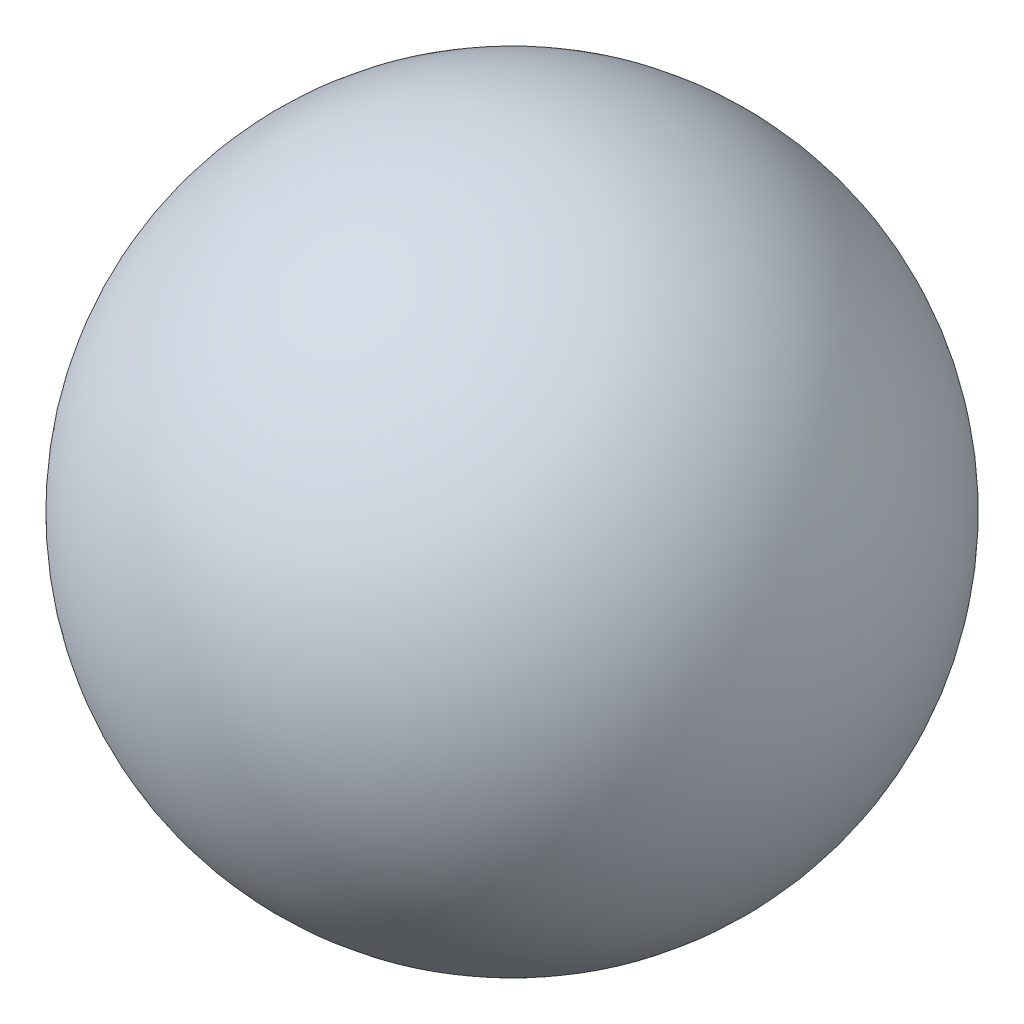
ISO-10303-21;
HEADER;
FILE_DESCRIPTION(('STEP AP214'),'2;1');
FILE_NAME('part.step','',(''),(''),'','','');
FILE_SCHEMA(('AUTOMOTIVE_DESIGN { 1 0 10303 214 1 1 1 1 }'));
ENDSEC;
DATA;
#1=APPLICATION_CONTEXT('core data for automotive mechanical design processes');
#2=APPLICATION_PROTOCOL_DEFINITION('international standard','automotive_design',2000,#1);
#3=PRODUCT_CONTEXT('',#1,'mechanical');
#4=PRODUCT('Part','Part','',(#3));
#5=PRODUCT_RELATED_PRODUCT_CATEGORY('part','',(#4));
#6=PRODUCT_DEFINITION_FORMATION('','',#4);
#7=PRODUCT_DEFINITION_CONTEXT('part definition',#1,'design');
#8=PRODUCT_DEFINITION('design','',#6,#7);
#9=PRODUCT_DEFINITION_SHAPE('','',#8);
#10=(LENGTH_UNIT() NAMED_UNIT(*) SI_UNIT(.MILLI.,.METRE.));
#11=(NAMED_UNIT(*) PLANE_ANGLE_UNIT() SI_UNIT($,.RADIAN.));
#12=(NAMED_UNIT(*) SI_UNIT($,.STERADIAN.) SOLID_ANGLE_UNIT());
#13=UNCERTAINTY_MEASURE_WITH_UNIT(LENGTH_MEASURE(1.E-05),#10,'distance_accuracy_value','');
#14=(GEOMETRIC_REPRESENTATION_CONTEXT(3) GLOBAL_UNCERTAINTY_ASSIGNED_CONTEXT((#13)) GLOBAL_UNIT_ASSIGNED_CONTEXT((#10,
#11,#12)) REPRESENTATION_CONTEXT('',''));
#15=CARTESIAN_POINT('',(0.,0.,0.));
#16=DIRECTION('',(0.,0.,1.));
#17=DIRECTION('',(1.,0.,0.));
#18=AXIS2_PLACEMENT_3D('',#15,#16,#17);
#19=CARTESIAN_POINT('',(0.,0.,0.));
#20=DIRECTION('',(0.,1.,0.));
#21=DIRECTION('',(1.,0.,0.));
#22=AXIS2_PLACEMENT_3D('',#19,#20,#21);
#23=SPHERICAL_SURFACE('',#22,4.52415147827306);
#24=CARTESIAN_POINT('',(0.,4.52415147827306,0.));
#25=VERTEX_POINT('',#24);
#26=VERTEX_LOOP('',#25);
#27=FACE_BOUND('',#26,.T.);
#28=ADVANCED_FACE('F39',(#27),#23,.T.);
#29=CLOSED_SHELL('',(#28));
#30=MANIFOLD_SOLID_BREP('B2',#29);
#31=ADVANCED_BREP_SHAPE_REPRESENTATION('',(#18,#30),#14);
#32=SHAPE_DEFINITION_REPRESENTATION(#9,#31);
ENDSEC;
END-ISO-10303-21;
